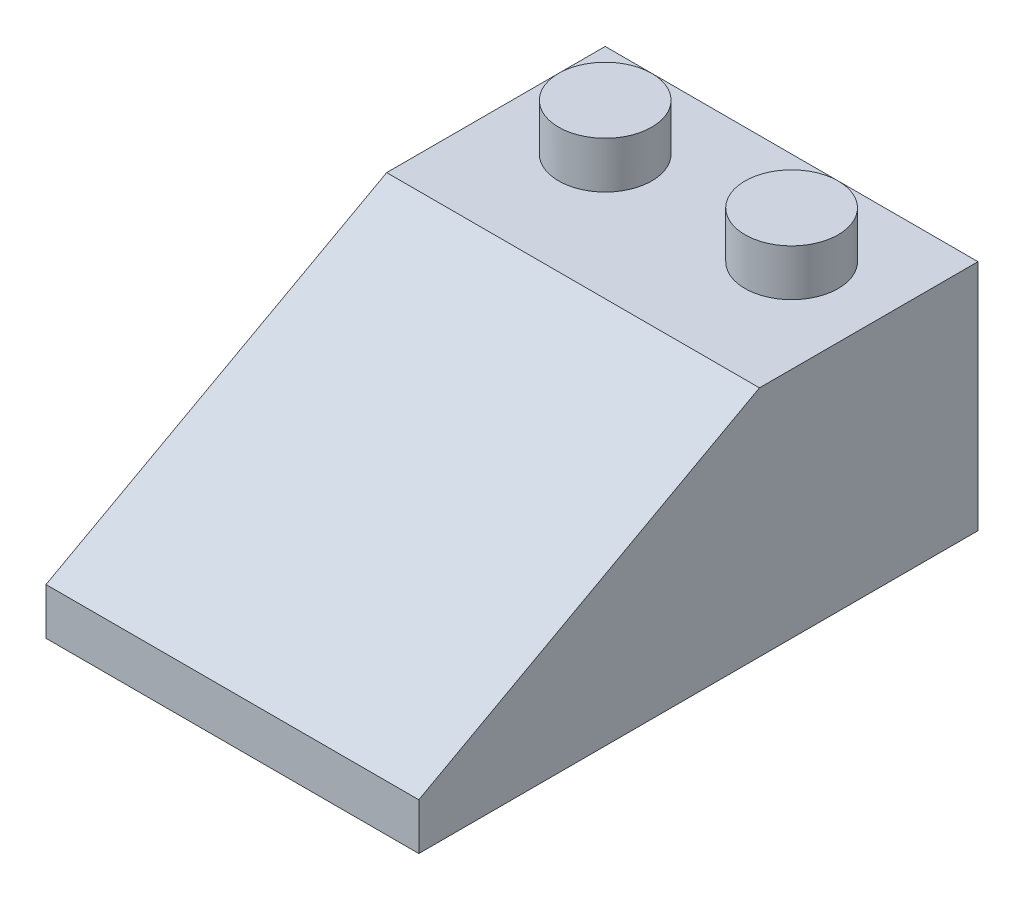
ISO-10303-21;
HEADER;
FILE_DESCRIPTION(('STEP AP214'),'2;1');
FILE_NAME('part.step','',(''),(''),'','','');
FILE_SCHEMA(('AUTOMOTIVE_DESIGN { 1 0 10303 214 1 1 1 1 }'));
ENDSEC;
DATA;
#1=APPLICATION_CONTEXT('core data for automotive mechanical design processes');
#2=APPLICATION_PROTOCOL_DEFINITION('international standard','automotive_design',2000,#1);
#3=PRODUCT_CONTEXT('',#1,'mechanical');
#4=PRODUCT('Part','Part','',(#3));
#5=PRODUCT_RELATED_PRODUCT_CATEGORY('part','',(#4));
#6=PRODUCT_DEFINITION_FORMATION('','',#4);
#7=PRODUCT_DEFINITION_CONTEXT('part definition',#1,'design');
#8=PRODUCT_DEFINITION('design','',#6,#7);
#9=PRODUCT_DEFINITION_SHAPE('','',#8);
#10=(LENGTH_UNIT() NAMED_UNIT(*) SI_UNIT(.MILLI.,.METRE.));
#11=(NAMED_UNIT(*) PLANE_ANGLE_UNIT() SI_UNIT($,.RADIAN.));
#12=(NAMED_UNIT(*) SI_UNIT($,.STERADIAN.) SOLID_ANGLE_UNIT());
#13=UNCERTAINTY_MEASURE_WITH_UNIT(LENGTH_MEASURE(1.E-05),#10,'distance_accuracy_value','');
#14=(GEOMETRIC_REPRESENTATION_CONTEXT(3) GLOBAL_UNCERTAINTY_ASSIGNED_CONTEXT((#13)) GLOBAL_UNIT_ASSIGNED_CONTEXT((#10,
#11,#12)) REPRESENTATION_CONTEXT('',''));
#15=CARTESIAN_POINT('',(0.,0.,0.));
#16=DIRECTION('',(0.,0.,1.));
#17=DIRECTION('',(1.,0.,0.));
#18=AXIS2_PLACEMENT_3D('',#15,#16,#17);
#19=CARTESIAN_POINT('',(16.,0.,0.));
#20=DIRECTION('',(0.,1.,0.));
#21=DIRECTION('',(0.,0.,1.));
#22=AXIS2_PLACEMENT_3D('',#19,#20,#21);
#23=PLANE('',#22);
#24=DIRECTION('',(0.,0.,-1.));
#25=VECTOR('',#24,1.);
#26=CARTESIAN_POINT('',(0.,0.,0.));
#27=LINE('',#26,#25);
#28=CARTESIAN_POINT('',(0.,0.,0.));
#29=VERTEX_POINT('',#28);
#30=CARTESIAN_POINT('',(0.,0.,-24.));
#31=VERTEX_POINT('',#30);
#32=EDGE_CURVE('E276',#29,#31,#27,.T.);
#33=ORIENTED_EDGE('',*,*,#32,.T.);
#34=DIRECTION('',(-1.,0.,0.));
#35=VECTOR('',#34,1.);
#36=CARTESIAN_POINT('',(16.,0.,-24.));
#37=LINE('',#36,#35);
#38=CARTESIAN_POINT('',(16.,0.,-24.));
#39=VERTEX_POINT('',#38);
#40=EDGE_CURVE('E298',#39,#31,#37,.T.);
#41=ORIENTED_EDGE('',*,*,#40,.F.);
#42=DIRECTION('',(0.,0.,-1.));
#43=VECTOR('',#42,1.);
#44=CARTESIAN_POINT('',(16.,0.,0.));
#45=LINE('',#44,#43);
#46=CARTESIAN_POINT('',(16.,0.,0.));
#47=VERTEX_POINT('',#46);
#48=EDGE_CURVE('E259',#47,#39,#45,.T.);
#49=ORIENTED_EDGE('',*,*,#48,.F.);
#50=DIRECTION('',(-1.,0.,0.));
#51=VECTOR('',#50,1.);
#52=CARTESIAN_POINT('',(16.,0.,0.));
#53=LINE('',#52,#51);
#54=EDGE_CURVE('E302',#47,#29,#53,.T.);
#55=ORIENTED_EDGE('',*,*,#54,.T.);
#56=EDGE_LOOP('',(#33,#41,#49,#55));
#57=FACE_BOUND('',#56,.T.);
#58=DIRECTION('',(0.,0.,-1.));
#59=VECTOR('',#58,1.);
#60=CARTESIAN_POINT('',(1.,0.,0.));
#61=LINE('',#60,#59);
#62=CARTESIAN_POINT('',(1.,0.,-1.));
#63=VERTEX_POINT('',#62);
#64=CARTESIAN_POINT('',(1.,0.,-23.));
#65=VERTEX_POINT('',#64);
#66=EDGE_CURVE('E188',#63,#65,#61,.T.);
#67=ORIENTED_EDGE('',*,*,#66,.F.);
#68=DIRECTION('',(-1.,0.,0.));
#69=VECTOR('',#68,1.);
#70=CARTESIAN_POINT('',(16.,0.,-1.));
#71=LINE('',#70,#69);
#72=CARTESIAN_POINT('',(15.,0.,-1.));
#73=VERTEX_POINT('',#72);
#74=EDGE_CURVE('E214',#73,#63,#71,.T.);
#75=ORIENTED_EDGE('',*,*,#74,.F.);
#76=DIRECTION('',(0.,0.,-1.));
#77=VECTOR('',#76,1.);
#78=CARTESIAN_POINT('',(15.,0.,0.));
#79=LINE('',#78,#77);
#80=CARTESIAN_POINT('',(15.,0.,-23.));
#81=VERTEX_POINT('',#80);
#82=EDGE_CURVE('E193',#73,#81,#79,.T.);
#83=ORIENTED_EDGE('',*,*,#82,.T.);
#84=DIRECTION('',(-1.,0.,0.));
#85=VECTOR('',#84,1.);
#86=CARTESIAN_POINT('',(16.,0.,-23.));
#87=LINE('',#86,#85);
#88=EDGE_CURVE('E224',#81,#65,#87,.T.);
#89=ORIENTED_EDGE('',*,*,#88,.T.);
#90=EDGE_LOOP('',(#67,#75,#83,#89));
#91=FACE_BOUND('',#90,.T.);
#92=ADVANCED_FACE('F57',(#57,#91),#23,.F.);
#93=CARTESIAN_POINT('',(16.,2.,0.));
#94=DIRECTION('',(0.,0.,-1.));
#95=DIRECTION('',(0.,1.,0.));
#96=AXIS2_PLACEMENT_3D('',#93,#94,#95);
#97=PLANE('',#96);
#98=DIRECTION('',(0.,-1.,0.));
#99=VECTOR('',#98,1.);
#100=CARTESIAN_POINT('',(0.,2.,0.));
#101=LINE('',#100,#99);
#102=CARTESIAN_POINT('',(0.,2.,0.));
#103=VERTEX_POINT('',#102);
#104=EDGE_CURVE('E251',#103,#29,#101,.T.);
#105=ORIENTED_EDGE('',*,*,#104,.T.);
#106=ORIENTED_EDGE('',*,*,#54,.F.);
#107=DIRECTION('',(0.,-1.,0.));
#108=VECTOR('',#107,1.);
#109=CARTESIAN_POINT('',(16.,2.,0.));
#110=LINE('',#109,#108);
#111=CARTESIAN_POINT('',(16.,2.,0.));
#112=VERTEX_POINT('',#111);
#113=EDGE_CURVE('E255',#112,#47,#110,.T.);
#114=ORIENTED_EDGE('',*,*,#113,.F.);
#115=DIRECTION('',(-1.,0.,0.));
#116=VECTOR('',#115,1.);
#117=CARTESIAN_POINT('',(16.,2.,0.));
#118=LINE('',#117,#116);
#119=EDGE_CURVE('E272',#112,#103,#118,.T.);
#120=ORIENTED_EDGE('',*,*,#119,.T.);
#121=EDGE_LOOP('',(#105,#106,#114,#120));
#122=FACE_BOUND('',#121,.T.);
#123=ADVANCED_FACE('F59',(#122),#97,.F.);
#124=CARTESIAN_POINT('',(16.,0.,-24.));
#125=DIRECTION('',(0.,0.,1.));
#126=DIRECTION('',(1.,0.,0.));
#127=AXIS2_PLACEMENT_3D('',#124,#125,#126);
#128=PLANE('',#127);
#129=DIRECTION('',(0.,1.,0.));
#130=VECTOR('',#129,1.);
#131=CARTESIAN_POINT('',(0.,0.,-24.));
#132=LINE('',#131,#130);
#133=CARTESIAN_POINT('',(0.,10.,-24.));
#134=VERTEX_POINT('',#133);
#135=EDGE_CURVE('E279',#31,#134,#132,.T.);
#136=ORIENTED_EDGE('',*,*,#135,.T.);
#137=DIRECTION('',(-1.,0.,0.));
#138=VECTOR('',#137,1.);
#139=CARTESIAN_POINT('',(16.,10.,-24.));
#140=LINE('',#139,#138);
#141=CARTESIAN_POINT('',(16.,10.,-24.));
#142=VERTEX_POINT('',#141);
#143=EDGE_CURVE('E294',#142,#134,#140,.T.);
#144=ORIENTED_EDGE('',*,*,#143,.F.);
#145=DIRECTION('',(0.,1.,0.));
#146=VECTOR('',#145,1.);
#147=CARTESIAN_POINT('',(16.,0.,-24.));
#148=LINE('',#147,#146);
#149=EDGE_CURVE('E263',#39,#142,#148,.T.);
#150=ORIENTED_EDGE('',*,*,#149,.F.);
#151=ORIENTED_EDGE('',*,*,#40,.T.);
#152=EDGE_LOOP('',(#136,#144,#150,#151));
#153=FACE_BOUND('',#152,.T.);
#154=ADVANCED_FACE('F319',(#153),#128,.F.);
#155=CARTESIAN_POINT('',(16.,10.,-24.));
#156=DIRECTION('',(0.,-1.,0.));
#157=DIRECTION('',(0.,0.,-1.));
#158=AXIS2_PLACEMENT_3D('',#155,#156,#157);
#159=PLANE('',#158);
#160=CARTESIAN_POINT('',(4.,10.,-20.));
#161=DIRECTION('',(0.,-1.,0.));
#162=DIRECTION('',(0.,0.,-1.));
#163=AXIS2_PLACEMENT_3D('',#160,#161,#162);
#164=CIRCLE('',#163,2.);
#165=CARTESIAN_POINT('',(4.,10.,-22.));
#166=VERTEX_POINT('',#165);
#167=EDGE_CURVE('E66',#166,#166,#164,.F.);
#168=ORIENTED_EDGE('',*,*,#167,.F.);
#169=EDGE_LOOP('',(#168));
#170=FACE_BOUND('',#169,.T.);
#171=CARTESIAN_POINT('',(12.,10.,-20.));
#172=DIRECTION('',(0.,-1.,0.));
#173=DIRECTION('',(0.,0.,-1.));
#174=AXIS2_PLACEMENT_3D('',#171,#172,#173);
#175=CIRCLE('',#174,2.);
#176=CARTESIAN_POINT('',(12.,10.,-22.));
#177=VERTEX_POINT('',#176);
#178=EDGE_CURVE('E306',#177,#177,#175,.F.);
#179=ORIENTED_EDGE('',*,*,#178,.F.);
#180=EDGE_LOOP('',(#179));
#181=FACE_BOUND('',#180,.T.);
#182=DIRECTION('',(0.,0.,1.));
#183=VECTOR('',#182,1.);
#184=CARTESIAN_POINT('',(0.,10.,-24.));
#185=LINE('',#184,#183);
#186=CARTESIAN_POINT('',(0.,10.,-14.6206896551724));
#187=VERTEX_POINT('',#186);
#188=EDGE_CURVE('E282',#134,#187,#185,.T.);
#189=ORIENTED_EDGE('',*,*,#188,.T.);
#190=DIRECTION('',(-1.,0.,0.));
#191=VECTOR('',#190,1.);
#192=CARTESIAN_POINT('',(16.,10.,-14.6206896551724));
#193=LINE('',#192,#191);
#194=CARTESIAN_POINT('',(16.,10.,-14.6206896551724));
#195=VERTEX_POINT('',#194);
#196=EDGE_CURVE('E290',#195,#187,#193,.T.);
#197=ORIENTED_EDGE('',*,*,#196,.F.);
#198=DIRECTION('',(0.,0.,1.));
#199=VECTOR('',#198,1.);
#200=CARTESIAN_POINT('',(16.,10.,-24.));
#201=LINE('',#200,#199);
#202=EDGE_CURVE('E266',#142,#195,#201,.T.);
#203=ORIENTED_EDGE('',*,*,#202,.F.);
#204=ORIENTED_EDGE('',*,*,#143,.T.);
#205=EDGE_LOOP('',(#189,#197,#203,#204));
#206=FACE_BOUND('',#205,.T.);
#207=ADVANCED_FACE('F315',(#170,#181,#206),#159,.F.);
#208=CARTESIAN_POINT('',(16.,10.,-14.6206896551724));
#209=DIRECTION('',(0.,-0.87726224191851,-0.480011415389373));
#210=DIRECTION('',(0.,0.480011415389373,-0.87726224191851));
#211=AXIS2_PLACEMENT_3D('',#208,#209,#210);
#212=PLANE('',#211);
#213=DIRECTION('',(0.,-0.480011415389373,0.87726224191851));
#214=VECTOR('',#213,1.);
#215=CARTESIAN_POINT('',(0.,10.,-14.6206896551724));
#216=LINE('',#215,#214);
#217=EDGE_CURVE('E260',#187,#103,#216,.T.);
#218=ORIENTED_EDGE('',*,*,#217,.T.);
#219=ORIENTED_EDGE('',*,*,#119,.F.);
#220=DIRECTION('',(0.,-0.480011415389373,0.87726224191851));
#221=VECTOR('',#220,1.);
#222=CARTESIAN_POINT('',(16.,10.,-14.6206896551724));
#223=LINE('',#222,#221);
#224=EDGE_CURVE('E269',#195,#112,#223,.T.);
#225=ORIENTED_EDGE('',*,*,#224,.F.);
#226=ORIENTED_EDGE('',*,*,#196,.T.);
#227=EDGE_LOOP('',(#218,#219,#225,#226));
#228=FACE_BOUND('',#227,.T.);
#229=ADVANCED_FACE('F318',(#228),#212,.F.);
#230=CARTESIAN_POINT('',(16.,0.,0.));
#231=DIRECTION('',(1.,0.,0.));
#232=DIRECTION('',(0.,0.,-1.));
#233=AXIS2_PLACEMENT_3D('',#230,#231,#232);
#234=PLANE('',#233);
#235=ORIENTED_EDGE('',*,*,#113,.T.);
#236=ORIENTED_EDGE('',*,*,#48,.T.);
#237=ORIENTED_EDGE('',*,*,#149,.T.);
#238=ORIENTED_EDGE('',*,*,#202,.T.);
#239=ORIENTED_EDGE('',*,*,#224,.T.);
#240=EDGE_LOOP('',(#235,#236,#237,#238,#239));
#241=FACE_BOUND('',#240,.T.);
#242=ADVANCED_FACE('F339',(#241),#234,.T.);
#243=CARTESIAN_POINT('',(0.,0.,0.));
#244=DIRECTION('',(1.,0.,0.));
#245=DIRECTION('',(0.,0.,-1.));
#246=AXIS2_PLACEMENT_3D('',#243,#244,#245);
#247=PLANE('',#246);
#248=ORIENTED_EDGE('',*,*,#104,.F.);
#249=ORIENTED_EDGE('',*,*,#217,.F.);
#250=ORIENTED_EDGE('',*,*,#188,.F.);
#251=ORIENTED_EDGE('',*,*,#135,.F.);
#252=ORIENTED_EDGE('',*,*,#32,.F.);
#253=EDGE_LOOP('',(#248,#249,#250,#251,#252));
#254=FACE_BOUND('',#253,.T.);
#255=ADVANCED_FACE('F334',(#254),#247,.F.);
#256=CARTESIAN_POINT('',(12.,12.,-20.));
#257=DIRECTION('',(0.,-1.,0.));
#258=DIRECTION('',(0.,0.,-1.));
#259=AXIS2_PLACEMENT_3D('',#256,#257,#258);
#260=CYLINDRICAL_SURFACE('',#259,2.);
#261=CARTESIAN_POINT('',(12.,12.,-20.));
#262=DIRECTION('',(0.,1.,0.));
#263=DIRECTION('',(0.,0.,-1.));
#264=AXIS2_PLACEMENT_3D('',#261,#262,#263);
#265=CIRCLE('',#264,2.);
#266=CARTESIAN_POINT('',(12.,12.,-22.));
#267=VERTEX_POINT('',#266);
#268=EDGE_CURVE('E209',#267,#267,#265,.T.);
#269=ORIENTED_EDGE('',*,*,#268,.F.);
#270=EDGE_LOOP('',(#269));
#271=FACE_BOUND('',#270,.T.);
#272=ORIENTED_EDGE('',*,*,#178,.T.);
#273=EDGE_LOOP('',(#272));
#274=FACE_BOUND('',#273,.T.);
#275=ADVANCED_FACE('F405',(#271,#274),#260,.T.);
#276=CARTESIAN_POINT('',(12.,12.,-20.));
#277=DIRECTION('',(0.,-1.,0.));
#278=DIRECTION('',(0.,0.,-1.));
#279=AXIS2_PLACEMENT_3D('',#276,#277,#278);
#280=PLANE('',#279);
#281=ORIENTED_EDGE('',*,*,#268,.T.);
#282=EDGE_LOOP('',(#281));
#283=FACE_BOUND('',#282,.T.);
#284=ADVANCED_FACE('F403',(#283),#280,.F.);
#285=CARTESIAN_POINT('',(4.,12.,-20.));
#286=DIRECTION('',(0.,-1.,0.));
#287=DIRECTION('',(0.,0.,-1.));
#288=AXIS2_PLACEMENT_3D('',#285,#286,#287);
#289=CYLINDRICAL_SURFACE('',#288,2.);
#290=CARTESIAN_POINT('',(4.,12.,-20.));
#291=DIRECTION('',(0.,1.,0.));
#292=DIRECTION('',(0.,0.,1.));
#293=AXIS2_PLACEMENT_3D('',#290,#291,#292);
#294=CIRCLE('',#293,2.);
#295=CARTESIAN_POINT('',(4.,12.,-18.));
#296=VERTEX_POINT('',#295);
#297=EDGE_CURVE('E247',#296,#296,#294,.T.);
#298=ORIENTED_EDGE('',*,*,#297,.F.);
#299=EDGE_LOOP('',(#298));
#300=FACE_BOUND('',#299,.T.);
#301=ORIENTED_EDGE('',*,*,#167,.T.);
#302=EDGE_LOOP('',(#301));
#303=FACE_BOUND('',#302,.T.);
#304=ADVANCED_FACE('F313',(#300,#303),#289,.T.);
#305=CARTESIAN_POINT('',(4.,12.,-20.));
#306=DIRECTION('',(0.,1.,0.));
#307=DIRECTION('',(0.,0.,1.));
#308=AXIS2_PLACEMENT_3D('',#305,#306,#307);
#309=PLANE('',#308);
#310=ORIENTED_EDGE('',*,*,#297,.T.);
#311=EDGE_LOOP('',(#310));
#312=FACE_BOUND('',#311,.T.);
#313=ADVANCED_FACE('F397',(#312),#309,.T.);
#314=CARTESIAN_POINT('',(16.,2.,-1.));
#315=DIRECTION('',(0.,0.,-1.));
#316=DIRECTION('',(0.,1.,0.));
#317=AXIS2_PLACEMENT_3D('',#314,#315,#316);
#318=PLANE('',#317);
#319=DIRECTION('',(0.,-1.,0.));
#320=VECTOR('',#319,1.);
#321=CARTESIAN_POINT('',(1.,2.,-1.));
#322=LINE('',#321,#320);
#323=CARTESIAN_POINT('',(1.,1.40725981381183,-1.));
#324=VERTEX_POINT('',#323);
#325=EDGE_CURVE('E184',#324,#63,#322,.T.);
#326=ORIENTED_EDGE('',*,*,#325,.F.);
#327=DIRECTION('',(-1.,0.,0.));
#328=VECTOR('',#327,1.);
#329=CARTESIAN_POINT('',(16.,1.40725981381183,-1.));
#330=LINE('',#329,#328);
#331=CARTESIAN_POINT('',(15.,1.40725981381183,-1.));
#332=VERTEX_POINT('',#331);
#333=EDGE_CURVE('E156',#332,#324,#330,.T.);
#334=ORIENTED_EDGE('',*,*,#333,.F.);
#335=DIRECTION('',(0.,-1.,0.));
#336=VECTOR('',#335,1.);
#337=CARTESIAN_POINT('',(15.,2.,-1.));
#338=LINE('',#337,#336);
#339=EDGE_CURVE('E190',#332,#73,#338,.T.);
#340=ORIENTED_EDGE('',*,*,#339,.T.);
#341=ORIENTED_EDGE('',*,*,#74,.T.);
#342=EDGE_LOOP('',(#326,#334,#340,#341));
#343=FACE_BOUND('',#342,.T.);
#344=ADVANCED_FACE('F361',(#343),#318,.T.);
#345=CARTESIAN_POINT('',(16.,0.,-23.));
#346=DIRECTION('',(0.,0.,1.));
#347=DIRECTION('',(1.,0.,0.));
#348=AXIS2_PLACEMENT_3D('',#345,#346,#347);
#349=PLANE('',#348);
#350=DIRECTION('',(0.,1.,0.));
#351=VECTOR('',#350,1.);
#352=CARTESIAN_POINT('',(1.,0.,-23.));
#353=LINE('',#352,#351);
#354=CARTESIAN_POINT('',(1.,9.,-23.));
#355=VERTEX_POINT('',#354);
#356=EDGE_CURVE('E217',#65,#355,#353,.T.);
#357=ORIENTED_EDGE('',*,*,#356,.F.);
#358=ORIENTED_EDGE('',*,*,#88,.F.);
#359=DIRECTION('',(0.,1.,0.));
#360=VECTOR('',#359,1.);
#361=CARTESIAN_POINT('',(15.,0.,-23.));
#362=LINE('',#361,#360);
#363=CARTESIAN_POINT('',(15.,9.,-23.));
#364=VERTEX_POINT('',#363);
#365=EDGE_CURVE('E220',#81,#364,#362,.T.);
#366=ORIENTED_EDGE('',*,*,#365,.T.);
#367=DIRECTION('',(-1.,0.,0.));
#368=VECTOR('',#367,1.);
#369=CARTESIAN_POINT('',(16.,9.,-23.));
#370=LINE('',#369,#368);
#371=EDGE_CURVE('E204',#364,#355,#370,.T.);
#372=ORIENTED_EDGE('',*,*,#371,.T.);
#373=EDGE_LOOP('',(#357,#358,#366,#372));
#374=FACE_BOUND('',#373,.T.);
#375=ADVANCED_FACE('F353',(#374),#349,.T.);
#376=CARTESIAN_POINT('',(16.,9.,-24.));
#377=DIRECTION('',(0.,-1.,0.));
#378=DIRECTION('',(0.,0.,-1.));
#379=AXIS2_PLACEMENT_3D('',#376,#377,#378);
#380=PLANE('',#379);
#381=CARTESIAN_POINT('',(8.,9.,-16.));
#382=DIRECTION('',(0.,-1.,0.));
#383=DIRECTION('',(0.,0.,-1.));
#384=AXIS2_PLACEMENT_3D('',#381,#382,#383);
#385=CIRCLE('',#384,2.7);
#386=CARTESIAN_POINT('',(10.4550955904881,9.,-14.8763872368267));
#387=VERTEX_POINT('',#386);
#388=CARTESIAN_POINT('',(5.54490440951193,9.,-14.8763872368267));
#389=VERTEX_POINT('',#388);
#390=EDGE_CURVE('E160',#387,#389,#385,.F.);
#391=ORIENTED_EDGE('',*,*,#390,.T.);
#392=DIRECTION('',(-1.,0.,0.));
#393=VECTOR('',#392,1.);
#394=CARTESIAN_POINT('',(16.,9.,-14.8763872368267));
#395=LINE('',#394,#393);
#396=CARTESIAN_POINT('',(1.,9.,-14.8763872368267));
#397=VERTEX_POINT('',#396);
#398=EDGE_CURVE('E146',#389,#397,#395,.T.);
#399=ORIENTED_EDGE('',*,*,#398,.T.);
#400=DIRECTION('',(0.,0.,1.));
#401=VECTOR('',#400,1.);
#402=CARTESIAN_POINT('',(1.,9.,-24.));
#403=LINE('',#402,#401);
#404=EDGE_CURVE('E199',#355,#397,#403,.T.);
#405=ORIENTED_EDGE('',*,*,#404,.F.);
#406=ORIENTED_EDGE('',*,*,#371,.F.);
#407=DIRECTION('',(0.,0.,1.));
#408=VECTOR('',#407,1.);
#409=CARTESIAN_POINT('',(15.,9.,-24.));
#410=LINE('',#409,#408);
#411=CARTESIAN_POINT('',(15.,9.,-14.8763872368267));
#412=VERTEX_POINT('',#411);
#413=EDGE_CURVE('E201',#364,#412,#410,.T.);
#414=ORIENTED_EDGE('',*,*,#413,.T.);
#415=EDGE_CURVE('E158',#412,#387,#395,.T.);
#416=ORIENTED_EDGE('',*,*,#415,.T.);
#417=EDGE_LOOP('',(#391,#399,#405,#406,#414,#416));
#418=FACE_BOUND('',#417,.T.);
#419=CARTESIAN_POINT('',(4.,9.,-20.));
#420=DIRECTION('',(0.,-1.,0.));
#421=DIRECTION('',(0.,0.,-1.));
#422=AXIS2_PLACEMENT_3D('',#419,#420,#421);
#423=CIRCLE('',#422,1.);
#424=CARTESIAN_POINT('',(4.,9.,-21.));
#425=VERTEX_POINT('',#424);
#426=EDGE_CURVE('E205',#425,#425,#423,.F.);
#427=ORIENTED_EDGE('',*,*,#426,.T.);
#428=EDGE_LOOP('',(#427));
#429=FACE_BOUND('',#428,.T.);
#430=CARTESIAN_POINT('',(12.,9.,-20.));
#431=DIRECTION('',(0.,-1.,0.));
#432=DIRECTION('',(0.,0.,-1.));
#433=AXIS2_PLACEMENT_3D('',#430,#431,#432);
#434=CIRCLE('',#433,1.);
#435=CARTESIAN_POINT('',(12.,9.,-21.));
#436=VERTEX_POINT('',#435);
#437=EDGE_CURVE('E210',#436,#436,#434,.F.);
#438=ORIENTED_EDGE('',*,*,#437,.T.);
#439=EDGE_LOOP('',(#438));
#440=FACE_BOUND('',#439,.T.);
#441=ADVANCED_FACE('F161',(#418,#429,#440),#380,.T.);
#442=CARTESIAN_POINT('',(16.,9.12273775808149,-15.1007010705618));
#443=DIRECTION('',(0.,-0.87726224191851,-0.480011415389373));
#444=DIRECTION('',(0.,0.480011415389373,-0.87726224191851));
#445=AXIS2_PLACEMENT_3D('',#442,#443,#444);
#446=PLANE('',#445);
#447=CARTESIAN_POINT('',(8.,5.23744849305712,-8.));
#448=DIRECTION('',(0.,-0.87726224191851,-0.480011415389373));
#449=DIRECTION('',(0.,-0.480011415389373,0.87726224191851));
#450=AXIS2_PLACEMENT_3D('',#447,#448,#449);
#451=ELLIPSE('',#450,3.07775699327409,2.7);
#452=CARTESIAN_POINT('',(8.,3.76009000249108,-5.3));
#453=VERTEX_POINT('',#452);
#454=EDGE_CURVE('E12',#453,#453,#451,.T.);
#455=ORIENTED_EDGE('',*,*,#454,.F.);
#456=EDGE_LOOP('',(#455));
#457=FACE_BOUND('',#456,.T.);
#458=CARTESIAN_POINT('',(8.,9.61480698362315,-16.));
#459=DIRECTION('',(0.,-0.87726224191851,-0.480011415389373));
#460=DIRECTION('',(0.,-0.480011415389373,0.87726224191851));
#461=AXIS2_PLACEMENT_3D('',#458,#459,#460);
#462=ELLIPSE('',#461,3.07775699327409,2.7);
#463=EDGE_CURVE('E80',#389,#387,#462,.F.);
#464=ORIENTED_EDGE('',*,*,#463,.T.);
#465=ORIENTED_EDGE('',*,*,#415,.F.);
#466=DIRECTION('',(0.,-0.480011415389373,0.87726224191851));
#467=VECTOR('',#466,1.);
#468=CARTESIAN_POINT('',(15.,9.12273775808149,-15.1007010705618));
#469=LINE('',#468,#467);
#470=EDGE_CURVE('E196',#412,#332,#469,.T.);
#471=ORIENTED_EDGE('',*,*,#470,.T.);
#472=ORIENTED_EDGE('',*,*,#333,.T.);
#473=DIRECTION('',(0.,-0.480011415389373,0.87726224191851));
#474=VECTOR('',#473,1.);
#475=CARTESIAN_POINT('',(1.,9.12273775808149,-15.1007010705618));
#476=LINE('',#475,#474);
#477=EDGE_CURVE('E150',#397,#324,#476,.T.);
#478=ORIENTED_EDGE('',*,*,#477,.F.);
#479=ORIENTED_EDGE('',*,*,#398,.F.);
#480=EDGE_LOOP('',(#464,#465,#471,#472,#478,#479));
#481=FACE_BOUND('',#480,.T.);
#482=ADVANCED_FACE('F148',(#457,#481),#446,.T.);
#483=CARTESIAN_POINT('',(15.,0.,0.));
#484=DIRECTION('',(1.,0.,0.));
#485=DIRECTION('',(0.,0.,-1.));
#486=AXIS2_PLACEMENT_3D('',#483,#484,#485);
#487=PLANE('',#486);
#488=ORIENTED_EDGE('',*,*,#339,.F.);
#489=ORIENTED_EDGE('',*,*,#470,.F.);
#490=ORIENTED_EDGE('',*,*,#413,.F.);
#491=ORIENTED_EDGE('',*,*,#365,.F.);
#492=ORIENTED_EDGE('',*,*,#82,.F.);
#493=EDGE_LOOP('',(#488,#489,#490,#491,#492));
#494=FACE_BOUND('',#493,.T.);
#495=ADVANCED_FACE('F364',(#494),#487,.F.);
#496=CARTESIAN_POINT('',(1.,0.,0.));
#497=DIRECTION('',(1.,0.,0.));
#498=DIRECTION('',(0.,0.,-1.));
#499=AXIS2_PLACEMENT_3D('',#496,#497,#498);
#500=PLANE('',#499);
#501=ORIENTED_EDGE('',*,*,#325,.T.);
#502=ORIENTED_EDGE('',*,*,#66,.T.);
#503=ORIENTED_EDGE('',*,*,#356,.T.);
#504=ORIENTED_EDGE('',*,*,#404,.T.);
#505=ORIENTED_EDGE('',*,*,#477,.T.);
#506=EDGE_LOOP('',(#501,#502,#503,#504,#505));
#507=FACE_BOUND('',#506,.T.);
#508=ADVANCED_FACE('F350',(#507),#500,.T.);
#509=CARTESIAN_POINT('',(12.,12.,-20.));
#510=DIRECTION('',(0.,-1.,0.));
#511=DIRECTION('',(0.,0.,-1.));
#512=AXIS2_PLACEMENT_3D('',#509,#510,#511);
#513=CYLINDRICAL_SURFACE('',#512,1.);
#514=CARTESIAN_POINT('',(12.,11.,-20.));
#515=DIRECTION('',(0.,-1.,0.));
#516=DIRECTION('',(0.,0.,-1.));
#517=AXIS2_PLACEMENT_3D('',#514,#515,#516);
#518=CIRCLE('',#517,1.);
#519=CARTESIAN_POINT('',(12.,11.,-21.));
#520=VERTEX_POINT('',#519);
#521=EDGE_CURVE('E229',#520,#520,#518,.F.);
#522=ORIENTED_EDGE('',*,*,#521,.T.);
#523=EDGE_LOOP('',(#522));
#524=FACE_BOUND('',#523,.T.);
#525=ORIENTED_EDGE('',*,*,#437,.F.);
#526=EDGE_LOOP('',(#525));
#527=FACE_BOUND('',#526,.T.);
#528=ADVANCED_FACE('F371',(#524,#527),#513,.F.);
#529=CARTESIAN_POINT('',(12.,11.,-20.));
#530=DIRECTION('',(0.,-1.,0.));
#531=DIRECTION('',(0.,0.,-1.));
#532=AXIS2_PLACEMENT_3D('',#529,#530,#531);
#533=PLANE('',#532);
#534=ORIENTED_EDGE('',*,*,#521,.F.);
#535=EDGE_LOOP('',(#534));
#536=FACE_BOUND('',#535,.T.);
#537=ADVANCED_FACE('F382',(#536),#533,.T.);
#538=CARTESIAN_POINT('',(4.,12.,-20.));
#539=DIRECTION('',(0.,-1.,0.));
#540=DIRECTION('',(0.,0.,-1.));
#541=AXIS2_PLACEMENT_3D('',#538,#539,#540);
#542=CYLINDRICAL_SURFACE('',#541,1.);
#543=CARTESIAN_POINT('',(4.,11.,-20.));
#544=DIRECTION('',(0.,1.,0.));
#545=DIRECTION('',(0.,0.,1.));
#546=AXIS2_PLACEMENT_3D('',#543,#544,#545);
#547=CIRCLE('',#546,1.);
#548=CARTESIAN_POINT('',(4.,11.,-19.));
#549=VERTEX_POINT('',#548);
#550=EDGE_CURVE('E189',#549,#549,#547,.T.);
#551=ORIENTED_EDGE('',*,*,#550,.T.);
#552=EDGE_LOOP('',(#551));
#553=FACE_BOUND('',#552,.T.);
#554=ORIENTED_EDGE('',*,*,#426,.F.);
#555=EDGE_LOOP('',(#554));
#556=FACE_BOUND('',#555,.T.);
#557=ADVANCED_FACE('F386',(#553,#556),#542,.F.);
#558=CARTESIAN_POINT('',(4.,11.,-20.));
#559=DIRECTION('',(0.,1.,0.));
#560=DIRECTION('',(0.,0.,1.));
#561=AXIS2_PLACEMENT_3D('',#558,#559,#560);
#562=PLANE('',#561);
#563=ORIENTED_EDGE('',*,*,#550,.F.);
#564=EDGE_LOOP('',(#563));
#565=FACE_BOUND('',#564,.T.);
#566=ADVANCED_FACE('F390',(#565),#562,.F.);
#567=CARTESIAN_POINT('',(8.,0.,-16.));
#568=DIRECTION('',(0.,1.,0.));
#569=DIRECTION('',(0.,0.,1.));
#570=AXIS2_PLACEMENT_3D('',#567,#568,#569);
#571=PLANE('',#570);
#572=CARTESIAN_POINT('',(8.,0.,-16.));
#573=DIRECTION('',(0.,-1.,0.));
#574=DIRECTION('',(0.,0.,1.));
#575=AXIS2_PLACEMENT_3D('',#572,#573,#574);
#576=CIRCLE('',#575,1.7);
#577=CARTESIAN_POINT('',(8.,0.,-14.3));
#578=VERTEX_POINT('',#577);
#579=EDGE_CURVE('E180',#578,#578,#576,.T.);
#580=ORIENTED_EDGE('',*,*,#579,.F.);
#581=EDGE_LOOP('',(#580));
#582=FACE_BOUND('',#581,.T.);
#583=CARTESIAN_POINT('',(8.,0.,-16.));
#584=DIRECTION('',(0.,-1.,0.));
#585=DIRECTION('',(0.,0.,1.));
#586=AXIS2_PLACEMENT_3D('',#583,#584,#585);
#587=CIRCLE('',#586,2.7);
#588=CARTESIAN_POINT('',(8.,0.,-13.3));
#589=VERTEX_POINT('',#588);
#590=EDGE_CURVE('E175',#589,#589,#587,.T.);
#591=ORIENTED_EDGE('',*,*,#590,.T.);
#592=EDGE_LOOP('',(#591));
#593=FACE_BOUND('',#592,.T.);
#594=ADVANCED_FACE('F394',(#582,#593),#571,.F.);
#595=CARTESIAN_POINT('',(8.,12.002,-16.));
#596=DIRECTION('',(0.,-1.,0.));
#597=DIRECTION('',(0.,0.,-1.));
#598=AXIS2_PLACEMENT_3D('',#595,#596,#597);
#599=CYLINDRICAL_SURFACE('',#598,2.7);
#600=ORIENTED_EDGE('',*,*,#463,.F.);
#601=ORIENTED_EDGE('',*,*,#390,.F.);
#602=EDGE_LOOP('',(#600,#601));
#603=FACE_BOUND('',#602,.T.);
#604=ORIENTED_EDGE('',*,*,#590,.F.);
#605=EDGE_LOOP('',(#604));
#606=FACE_BOUND('',#605,.T.);
#607=ADVANCED_FACE('F166',(#603,#606),#599,.T.);
#608=CARTESIAN_POINT('',(8.,12.002,-16.));
#609=DIRECTION('',(0.,-1.,0.));
#610=DIRECTION('',(0.,0.,-1.));
#611=AXIS2_PLACEMENT_3D('',#608,#609,#610);
#612=CYLINDRICAL_SURFACE('',#611,1.7);
#613=CARTESIAN_POINT('',(8.,9.,-16.));
#614=DIRECTION('',(0.,-1.,0.));
#615=DIRECTION('',(0.,0.,-1.));
#616=AXIS2_PLACEMENT_3D('',#613,#614,#615);
#617=CIRCLE('',#616,1.7);
#618=CARTESIAN_POINT('',(9.27573287111133,9.,-14.8763872368267));
#619=VERTEX_POINT('',#618);
#620=CARTESIAN_POINT('',(6.72426712888868,9.,-14.8763872368267));
#621=VERTEX_POINT('',#620);
#622=EDGE_CURVE('E72',#619,#621,#617,.F.);
#623=ORIENTED_EDGE('',*,*,#622,.T.);
#624=CARTESIAN_POINT('',(8.,9.61480698362315,-16.));
#625=DIRECTION('',(0.,-0.87726224191851,-0.480011415389373));
#626=DIRECTION('',(0.,-0.480011415389373,0.87726224191851));
#627=AXIS2_PLACEMENT_3D('',#624,#625,#626);
#628=ELLIPSE('',#627,1.93784699576517,1.7);
#629=EDGE_CURVE('E169',#621,#619,#628,.F.);
#630=ORIENTED_EDGE('',*,*,#629,.T.);
#631=EDGE_LOOP('',(#623,#630));
#632=FACE_BOUND('',#631,.T.);
#633=ORIENTED_EDGE('',*,*,#579,.T.);
#634=EDGE_LOOP('',(#633));
#635=FACE_BOUND('',#634,.T.);
#636=ADVANCED_FACE('F396',(#632,#635),#612,.F.);
#637=CARTESIAN_POINT('',(8.,0.,-8.));
#638=DIRECTION('',(0.,-1.,0.));
#639=DIRECTION('',(0.,0.,-1.));
#640=AXIS2_PLACEMENT_3D('',#637,#638,#639);
#641=PLANE('',#640);
#642=CARTESIAN_POINT('',(8.,0.,-8.));
#643=DIRECTION('',(0.,-1.,0.));
#644=DIRECTION('',(0.,0.,-1.));
#645=AXIS2_PLACEMENT_3D('',#642,#643,#644);
#646=CIRCLE('',#645,1.7);
#647=CARTESIAN_POINT('',(8.,0.,-9.7));
#648=VERTEX_POINT('',#647);
#649=EDGE_CURVE('E632',#648,#648,#646,.T.);
#650=ORIENTED_EDGE('',*,*,#649,.F.);
#651=EDGE_LOOP('',(#650));
#652=FACE_BOUND('',#651,.T.);
#653=CARTESIAN_POINT('',(8.,0.,-8.));
#654=DIRECTION('',(0.,-1.,0.));
#655=DIRECTION('',(0.,0.,-1.));
#656=AXIS2_PLACEMENT_3D('',#653,#654,#655);
#657=CIRCLE('',#656,2.7);
#658=CARTESIAN_POINT('',(8.,0.,-10.7));
#659=VERTEX_POINT('',#658);
#660=EDGE_CURVE('E179',#659,#659,#657,.T.);
#661=ORIENTED_EDGE('',*,*,#660,.T.);
#662=EDGE_LOOP('',(#661));
#663=FACE_BOUND('',#662,.T.);
#664=ADVANCED_FACE('F557',(#652,#663),#641,.T.);
#665=CARTESIAN_POINT('',(8.,12.002,-8.));
#666=DIRECTION('',(0.,-1.,0.));
#667=DIRECTION('',(0.,0.,-1.));
#668=AXIS2_PLACEMENT_3D('',#665,#666,#667);
#669=CYLINDRICAL_SURFACE('',#668,2.7);
#670=ORIENTED_EDGE('',*,*,#454,.T.);
#671=EDGE_LOOP('',(#670));
#672=FACE_BOUND('',#671,.T.);
#673=ORIENTED_EDGE('',*,*,#660,.F.);
#674=EDGE_LOOP('',(#673));
#675=FACE_BOUND('',#674,.T.);
#676=ADVANCED_FACE('F602',(#672,#675),#669,.T.);
#677=CARTESIAN_POINT('',(8.,12.002,-8.));
#678=DIRECTION('',(0.,-1.,0.));
#679=DIRECTION('',(0.,0.,-1.));
#680=AXIS2_PLACEMENT_3D('',#677,#678,#679);
#681=CYLINDRICAL_SURFACE('',#680,1.7);
#682=CARTESIAN_POINT('',(8.,5.23744849305712,-8.));
#683=DIRECTION('',(0.,-0.87726224191851,-0.480011415389373));
#684=DIRECTION('',(0.,-0.480011415389373,0.87726224191851));
#685=AXIS2_PLACEMENT_3D('',#682,#683,#684);
#686=ELLIPSE('',#685,1.93784699576517,1.7);
#687=CARTESIAN_POINT('',(8.,4.30725981381183,-6.3));
#688=VERTEX_POINT('',#687);
#689=EDGE_CURVE('E233',#688,#688,#686,.F.);
#690=ORIENTED_EDGE('',*,*,#689,.T.);
#691=EDGE_LOOP('',(#690));
#692=FACE_BOUND('',#691,.T.);
#693=ORIENTED_EDGE('',*,*,#649,.T.);
#694=EDGE_LOOP('',(#693));
#695=FACE_BOUND('',#694,.T.);
#696=ADVANCED_FACE('F555',(#692,#695),#681,.F.);
#697=EDGE_CURVE('E155',#619,#621,#395,.T.);
#698=ORIENTED_EDGE('',*,*,#697,.F.);
#699=ORIENTED_EDGE('',*,*,#629,.F.);
#700=EDGE_LOOP('',(#698,#699));
#701=FACE_BOUND('',#700,.T.);
#702=ADVANCED_FACE('F377',(#701),#446,.T.);
#703=ORIENTED_EDGE('',*,*,#697,.T.);
#704=ORIENTED_EDGE('',*,*,#622,.F.);
#705=EDGE_LOOP('',(#703,#704));
#706=FACE_BOUND('',#705,.T.);
#707=ADVANCED_FACE('F506',(#706),#380,.T.);
#708=ORIENTED_EDGE('',*,*,#689,.F.);
#709=EDGE_LOOP('',(#708));
#710=FACE_BOUND('',#709,.T.);
#711=ADVANCED_FACE('F376',(#710),#446,.T.);
#712=CLOSED_SHELL('',(#92,#123,#154,#207,#229,#242,#255,#275,#284,#304,#313,#344,#375,#441,#482,
#495,#508,#528,#537,#557,#566,#594,#607,#636,#664,#676,#696,#702,#707,#711));
#713=MANIFOLD_SOLID_BREP('B2',#712);
#714=ADVANCED_BREP_SHAPE_REPRESENTATION('',(#18,#713),#14);
#715=SHAPE_DEFINITION_REPRESENTATION(#9,#714);
ENDSEC;
END-ISO-10303-21;
